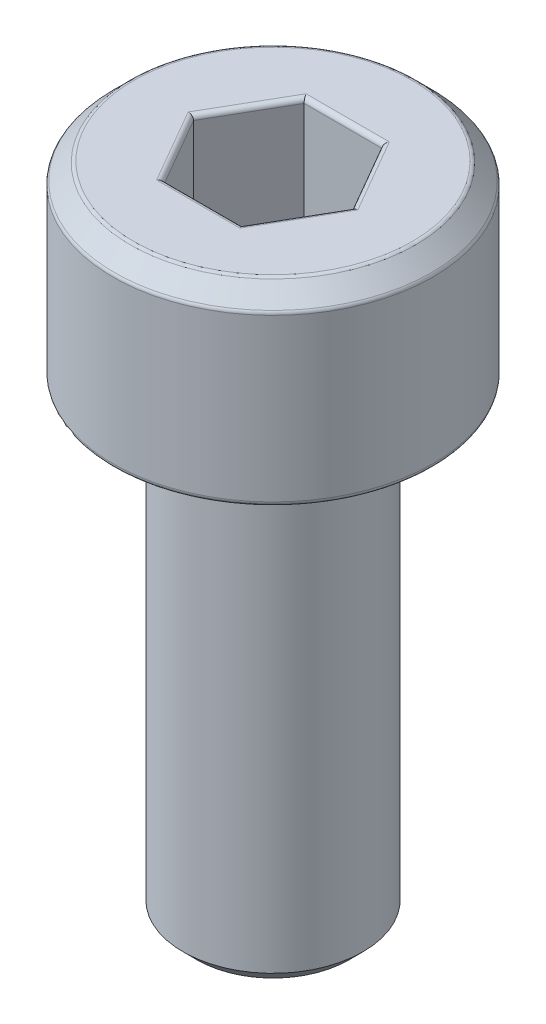
ISO-10303-21;
HEADER;
FILE_DESCRIPTION(('STEP AP214'),'2;1');
FILE_NAME('part.step','',(''),(''),'','','');
FILE_SCHEMA(('AUTOMOTIVE_DESIGN { 1 0 10303 214 1 1 1 1 }'));
ENDSEC;
DATA;
#1=APPLICATION_CONTEXT('core data for automotive mechanical design processes');
#2=APPLICATION_PROTOCOL_DEFINITION('international standard','automotive_design',2000,#1);
#3=PRODUCT_CONTEXT('',#1,'mechanical');
#4=PRODUCT('Part','Part','',(#3));
#5=PRODUCT_RELATED_PRODUCT_CATEGORY('part','',(#4));
#6=PRODUCT_DEFINITION_FORMATION('','',#4);
#7=PRODUCT_DEFINITION_CONTEXT('part definition',#1,'design');
#8=PRODUCT_DEFINITION('design','',#6,#7);
#9=PRODUCT_DEFINITION_SHAPE('','',#8);
#10=(LENGTH_UNIT() NAMED_UNIT(*) SI_UNIT(.MILLI.,.METRE.));
#11=(NAMED_UNIT(*) PLANE_ANGLE_UNIT() SI_UNIT($,.RADIAN.));
#12=(NAMED_UNIT(*) SI_UNIT($,.STERADIAN.) SOLID_ANGLE_UNIT());
#13=UNCERTAINTY_MEASURE_WITH_UNIT(LENGTH_MEASURE(1.E-05),#10,'distance_accuracy_value','');
#14=(GEOMETRIC_REPRESENTATION_CONTEXT(3) GLOBAL_UNCERTAINTY_ASSIGNED_CONTEXT((#13)) GLOBAL_UNIT_ASSIGNED_CONTEXT((#10,
#11,#12)) REPRESENTATION_CONTEXT('',''));
#15=CARTESIAN_POINT('',(0.,0.,0.));
#16=DIRECTION('',(0.,0.,1.));
#17=DIRECTION('',(1.,0.,0.));
#18=AXIS2_PLACEMENT_3D('',#15,#16,#17);
#19=CARTESIAN_POINT('',(0.,-14.,0.));
#20=DIRECTION('',(0.,-1.,0.));
#21=DIRECTION('',(0.,0.,-1.));
#22=AXIS2_PLACEMENT_3D('',#19,#20,#21);
#23=PLANE('',#22);
#24=CARTESIAN_POINT('',(0.,-14.,0.));
#25=DIRECTION('',(0.,1.,0.));
#26=DIRECTION('',(-1.,0.,0.));
#27=AXIS2_PLACEMENT_3D('',#24,#25,#26);
#28=CIRCLE('',#27,1.625);
#29=CARTESIAN_POINT('',(-1.625,-14.,0.));
#30=VERTEX_POINT('',#29);
#31=EDGE_CURVE('E11',#30,#30,#28,.T.);
#32=ORIENTED_EDGE('',*,*,#31,.F.);
#33=EDGE_LOOP('',(#32));
#34=FACE_BOUND('',#33,.T.);
#35=ADVANCED_FACE('F17',(#34),#23,.T.);
#36=CARTESIAN_POINT('',(0.,-13.85,0.));
#37=DIRECTION('',(0.,1.,0.));
#38=DIRECTION('',(1.,0.,0.));
#39=AXIS2_PLACEMENT_3D('',#36,#37,#38);
#40=CONICAL_SURFACE('',#39,1.775,0.785398163397448);
#41=CARTESIAN_POINT('',(0.,-13.7,0.));
#42=DIRECTION('',(0.,1.,0.));
#43=DIRECTION('',(-1.,0.,0.));
#44=AXIS2_PLACEMENT_3D('',#41,#42,#43);
#45=CIRCLE('',#44,1.925);
#46=CARTESIAN_POINT('',(1.925,-13.7,0.));
#47=VERTEX_POINT('',#46);
#48=EDGE_CURVE('E267',#47,#47,#45,.T.);
#49=ORIENTED_EDGE('',*,*,#48,.F.);
#50=EDGE_LOOP('',(#49));
#51=FACE_BOUND('',#50,.T.);
#52=ORIENTED_EDGE('',*,*,#31,.T.);
#53=EDGE_LOOP('',(#52));
#54=FACE_BOUND('',#53,.T.);
#55=ADVANCED_FACE('F732',(#51,#54),#40,.T.);
#56=CARTESIAN_POINT('',(0.,0.7,0.));
#57=DIRECTION('',(0.,-1.,0.));
#58=DIRECTION('',(-1.,0.,0.));
#59=AXIS2_PLACEMENT_3D('',#56,#57,#58);
#60=CYLINDRICAL_SURFACE('',#59,1.925);
#61=ORIENTED_EDGE('',*,*,#48,.T.);
#62=DIRECTION('',(0.,1.,0.));
#63=VECTOR('',#62,1.);
#64=CARTESIAN_POINT('',(1.925,0.7,0.));
#65=LINE('',#64,#63);
#66=CARTESIAN_POINT('',(1.925,-4.,0.));
#67=VERTEX_POINT('',#66);
#68=EDGE_CURVE('E28',#47,#67,#65,.T.);
#69=ORIENTED_EDGE('',*,*,#68,.T.);
#70=CARTESIAN_POINT('',(0.,-4.,0.));
#71=DIRECTION('',(0.,-1.,0.));
#72=DIRECTION('',(-1.,0.,0.));
#73=AXIS2_PLACEMENT_3D('',#70,#71,#72);
#74=CIRCLE('',#73,1.925);
#75=EDGE_CURVE('E320',#67,#67,#74,.T.);
#76=ORIENTED_EDGE('',*,*,#75,.T.);
#77=ORIENTED_EDGE('',*,*,#68,.F.);
#78=EDGE_LOOP('',(#61,#69,#76,#77));
#79=FACE_BOUND('',#78,.T.);
#80=ADVANCED_FACE('F722',(#79),#60,.T.);
#81=CARTESIAN_POINT('',(0.,-4.,0.));
#82=DIRECTION('',(0.,-1.,0.));
#83=DIRECTION('',(0.,0.,-1.));
#84=AXIS2_PLACEMENT_3D('',#81,#82,#83);
#85=PLANE('',#84);
#86=ORIENTED_EDGE('',*,*,#75,.F.);
#87=EDGE_LOOP('',(#86));
#88=FACE_BOUND('',#87,.T.);
#89=CARTESIAN_POINT('',(0.,-4.,0.));
#90=DIRECTION('',(0.,-1.,0.));
#91=DIRECTION('',(1.,0.,0.));
#92=AXIS2_PLACEMENT_3D('',#89,#90,#91);
#93=CIRCLE('',#92,3.325);
#94=CARTESIAN_POINT('',(-3.32490288162923,-4.,0.0254131409641802));
#95=VERTEX_POINT('',#94);
#96=EDGE_CURVE('E300',#95,#95,#93,.T.);
#97=ORIENTED_EDGE('',*,*,#96,.T.);
#98=EDGE_LOOP('',(#97));
#99=FACE_BOUND('',#98,.T.);
#100=ADVANCED_FACE('F713',(#88,#99),#85,.T.);
#101=CARTESIAN_POINT('',(0.,-3.9,0.));
#102=DIRECTION('',(0.,-1.,0.));
#103=DIRECTION('',(0.999970791467437,0.,-0.00764304991403928));
#104=AXIS2_PLACEMENT_3D('',#101,#102,#103);
#105=TOROIDAL_SURFACE('',#104,3.325,0.1);
#106=ORIENTED_EDGE('',*,*,#96,.F.);
#107=CARTESIAN_POINT('',(-3.32490288162923,-3.9,0.0254131409641802));
#108=DIRECTION('',(-0.00764304991403916,0.,-0.999970791467437));
#109=DIRECTION('',(-0.999970791467437,0.,0.00764304991403916));
#110=AXIS2_PLACEMENT_3D('',#107,#108,#109);
#111=CIRCLE('',#110,0.1);
#112=CARTESIAN_POINT('',(-3.42489996077597,-3.9,0.0261774459555841));
#113=VERTEX_POINT('',#112);
#114=EDGE_CURVE('E304',#95,#113,#111,.T.);
#115=ORIENTED_EDGE('',*,*,#114,.T.);
#116=CARTESIAN_POINT('',(0.,-3.9,0.));
#117=DIRECTION('',(0.,-1.,0.));
#118=DIRECTION('',(1.,0.,0.));
#119=AXIS2_PLACEMENT_3D('',#116,#117,#118);
#120=CIRCLE('',#119,3.425);
#121=CARTESIAN_POINT('',(3.425,-3.9,0.));
#122=VERTEX_POINT('',#121);
#123=EDGE_CURVE('E242',#113,#122,#120,.T.);
#124=ORIENTED_EDGE('',*,*,#123,.T.);
#125=CARTESIAN_POINT('',(0.,-3.9,0.));
#126=DIRECTION('',(0.,-1.,0.));
#127=DIRECTION('',(1.,0.,0.));
#128=AXIS2_PLACEMENT_3D('',#125,#126,#127);
#129=CIRCLE('',#128,3.425);
#130=EDGE_CURVE('E237',#122,#113,#129,.T.);
#131=ORIENTED_EDGE('',*,*,#130,.T.);
#132=ORIENTED_EDGE('',*,*,#114,.F.);
#133=EDGE_LOOP('',(#106,#115,#124,#131,#132));
#134=FACE_BOUND('',#133,.T.);
#135=ADVANCED_FACE('F704',(#134),#105,.T.);
#136=CARTESIAN_POINT('',(0.,0.7,0.));
#137=DIRECTION('',(0.,-1.,0.));
#138=DIRECTION('',(-1.,0.,0.));
#139=AXIS2_PLACEMENT_3D('',#136,#137,#138);
#140=CYLINDRICAL_SURFACE('',#139,3.425);
#141=ORIENTED_EDGE('',*,*,#123,.F.);
#142=ORIENTED_EDGE('',*,*,#130,.F.);
#143=DIRECTION('',(0.,1.,0.));
#144=VECTOR('',#143,1.);
#145=CARTESIAN_POINT('',(3.425,0.7,0.));
#146=LINE('',#145,#144);
#147=CARTESIAN_POINT('',(3.425,-0.4414213562373,0.));
#148=VERTEX_POINT('',#147);
#149=EDGE_CURVE('E241',#122,#148,#146,.T.);
#150=ORIENTED_EDGE('',*,*,#149,.T.);
#151=CARTESIAN_POINT('',(0.,-0.4414213562373,0.));
#152=DIRECTION('',(0.,-1.,0.));
#153=DIRECTION('',(1.,0.,0.));
#154=AXIS2_PLACEMENT_3D('',#151,#152,#153);
#155=CIRCLE('',#154,3.425);
#156=CARTESIAN_POINT('',(-3.42489007865533,-0.4414213562373,0.027439918518789));
#157=VERTEX_POINT('',#156);
#158=EDGE_CURVE('E110',#148,#157,#155,.T.);
#159=ORIENTED_EDGE('',*,*,#158,.T.);
#160=CARTESIAN_POINT('',(0.,-0.4414213562373,0.));
#161=DIRECTION('',(0.,-1.,0.));
#162=DIRECTION('',(1.,0.,0.));
#163=AXIS2_PLACEMENT_3D('',#160,#161,#162);
#164=CIRCLE('',#163,3.425);
#165=EDGE_CURVE('E249',#157,#148,#164,.T.);
#166=ORIENTED_EDGE('',*,*,#165,.T.);
#167=ORIENTED_EDGE('',*,*,#149,.F.);
#168=EDGE_LOOP('',(#141,#142,#150,#159,#166,#167));
#169=FACE_BOUND('',#168,.T.);
#170=ADVANCED_FACE('F694',(#169),#140,.T.);
#171=CARTESIAN_POINT('',(0.,-0.4414213562373,0.));
#172=DIRECTION('',(0.,-1.,0.));
#173=DIRECTION('',(0.999967906176737,0.,-0.0080116550419823));
#174=AXIS2_PLACEMENT_3D('',#171,#172,#173);
#175=TOROIDAL_SURFACE('',#174,3.325,0.1);
#176=ORIENTED_EDGE('',*,*,#165,.F.);
#177=CARTESIAN_POINT('',(-3.32489328803765,-0.4414213562373,0.0266387530145907));
#178=DIRECTION('',(-0.00801165504198218,0.,-0.999967906176737));
#179=DIRECTION('',(-0.999967906176737,0.,0.00801165504198218));
#180=AXIS2_PLACEMENT_3D('',#177,#178,#179);
#181=CIRCLE('',#180,0.1);
#182=CARTESIAN_POINT('',(-3.39560169678065,-0.3707106781187,0.0272052625754648));
#183=VERTEX_POINT('',#182);
#184=EDGE_CURVE('E252',#157,#183,#181,.T.);
#185=ORIENTED_EDGE('',*,*,#184,.T.);
#186=CARTESIAN_POINT('',(0.,-0.3707106781187,0.));
#187=DIRECTION('',(0.,-1.,0.));
#188=DIRECTION('',(-1.,0.,0.));
#189=AXIS2_PLACEMENT_3D('',#186,#187,#188);
#190=CIRCLE('',#189,3.395710678119);
#191=CARTESIAN_POINT('',(3.39571067811885,-0.37071067811885,0.));
#192=VERTEX_POINT('',#191);
#193=EDGE_CURVE('E288',#183,#192,#190,.T.);
#194=ORIENTED_EDGE('',*,*,#193,.T.);
#195=CARTESIAN_POINT('',(0.,-0.3707106781187,0.));
#196=DIRECTION('',(0.,-1.,0.));
#197=DIRECTION('',(-1.,0.,0.));
#198=AXIS2_PLACEMENT_3D('',#195,#196,#197);
#199=CIRCLE('',#198,3.395710678119);
#200=EDGE_CURVE('E299',#192,#183,#199,.T.);
#201=ORIENTED_EDGE('',*,*,#200,.T.);
#202=ORIENTED_EDGE('',*,*,#184,.F.);
#203=ORIENTED_EDGE('',*,*,#158,.F.);
#204=EDGE_LOOP('',(#176,#185,#194,#201,#202,#203));
#205=FACE_BOUND('',#204,.T.);
#206=ADVANCED_FACE('F685',(#205),#175,.T.);
#207=CARTESIAN_POINT('',(0.,-0.2,0.));
#208=DIRECTION('',(0.,-1.,0.));
#209=DIRECTION('',(-1.,0.,0.));
#210=AXIS2_PLACEMENT_3D('',#207,#208,#209);
#211=CONICAL_SURFACE('',#210,3.225,0.785398163397448);
#212=ORIENTED_EDGE('',*,*,#193,.F.);
#213=ORIENTED_EDGE('',*,*,#200,.F.);
#214=DIRECTION('',(-0.707106781186548,0.707106781186548,0.));
#215=VECTOR('',#214,1.);
#216=CARTESIAN_POINT('',(3.225,-0.2,0.));
#217=LINE('',#216,#215);
#218=CARTESIAN_POINT('',(3.054289321881,-0.02928932188135,0.));
#219=VERTEX_POINT('',#218);
#220=EDGE_CURVE('E55',#192,#219,#217,.T.);
#221=ORIENTED_EDGE('',*,*,#220,.T.);
#222=CARTESIAN_POINT('',(0.,-0.02928932188135,0.));
#223=DIRECTION('',(0.,-1.,0.));
#224=DIRECTION('',(-1.,0.,0.));
#225=AXIS2_PLACEMENT_3D('',#222,#223,#224);
#226=CIRCLE('',#225,3.054289321881);
#227=CARTESIAN_POINT('',(3.0541787631495,-0.02928932188135,-0.025987390843776));
#228=VERTEX_POINT('',#227);
#229=EDGE_CURVE('E278',#219,#228,#226,.T.);
#230=ORIENTED_EDGE('',*,*,#229,.T.);
#231=CARTESIAN_POINT('',(0.,-0.02928932188135,0.));
#232=DIRECTION('',(0.,-1.,0.));
#233=DIRECTION('',(-1.,0.,0.));
#234=AXIS2_PLACEMENT_3D('',#231,#232,#233);
#235=CIRCLE('',#234,3.054289321881);
#236=EDGE_CURVE('E289',#228,#219,#235,.T.);
#237=ORIENTED_EDGE('',*,*,#236,.T.);
#238=ORIENTED_EDGE('',*,*,#220,.F.);
#239=EDGE_LOOP('',(#212,#213,#221,#230,#237,#238));
#240=FACE_BOUND('',#239,.T.);
#241=ADVANCED_FACE('F675',(#240),#211,.T.);
#242=CARTESIAN_POINT('',(0.,-0.1,0.));
#243=DIRECTION('',(0.,-1.,0.));
#244=DIRECTION('',(-0.999963802141891,0.,0.00850849022638493));
#245=AXIS2_PLACEMENT_3D('',#242,#243,#244);
#246=TOROIDAL_SURFACE('',#245,2.983578643763,0.1);
#247=ORIENTED_EDGE('',*,*,#229,.F.);
#248=ORIENTED_EDGE('',*,*,#236,.F.);
#249=CARTESIAN_POINT('',(2.9834706446066,-0.1,-0.0253857497301079));
#250=DIRECTION('',(0.0085084902263848,0.,0.999963802141891));
#251=DIRECTION('',(0.999963802141891,0.,-0.0085084902263848));
#252=AXIS2_PLACEMENT_3D('',#249,#250,#251);
#253=CIRCLE('',#252,0.1);
#254=CARTESIAN_POINT('',(2.9834706446066,0.,-0.0253857497301079));
#255=VERTEX_POINT('',#254);
#256=EDGE_CURVE('E284',#228,#255,#253,.T.);
#257=ORIENTED_EDGE('',*,*,#256,.T.);
#258=CARTESIAN_POINT('',(0.,0.,0.));
#259=DIRECTION('',(0.,-1.,0.));
#260=DIRECTION('',(-1.,0.,0.));
#261=AXIS2_PLACEMENT_3D('',#258,#259,#260);
#262=CIRCLE('',#261,2.983578643763);
#263=EDGE_CURVE('E235',#255,#255,#262,.T.);
#264=ORIENTED_EDGE('',*,*,#263,.T.);
#265=ORIENTED_EDGE('',*,*,#256,.F.);
#266=EDGE_LOOP('',(#247,#248,#257,#264,#265));
#267=FACE_BOUND('',#266,.T.);
#268=ADVANCED_FACE('F666',(#267),#246,.T.);
#269=CARTESIAN_POINT('',(0.,-4.,0.));
#270=DIRECTION('',(0.,1.,0.));
#271=DIRECTION('',(1.,0.,0.));
#272=AXIS2_PLACEMENT_3D('',#269,#270,#271);
#273=PLANE('',#272);
#274=DIRECTION('',(-0.500000000000017,0.,0.866025403784429));
#275=VECTOR('',#274,1.);
#276=CARTESIAN_POINT('',(-0.8339745962156,-4.,-1.5));
#277=LINE('',#276,#275);
#278=CARTESIAN_POINT('',(-0.8339745962156,-4.,-1.5));
#279=VERTEX_POINT('',#278);
#280=CARTESIAN_POINT('',(-1.7,-4.,0.));
#281=VERTEX_POINT('',#280);
#282=EDGE_CURVE('E292',#279,#281,#277,.T.);
#283=ORIENTED_EDGE('',*,*,#282,.T.);
#284=DIRECTION('',(0.500000000000017,0.,0.866025403784429));
#285=VECTOR('',#284,1.);
#286=CARTESIAN_POINT('',(-1.7,-4.,0.));
#287=LINE('',#286,#285);
#288=CARTESIAN_POINT('',(-0.8339745962156,-4.,1.5));
#289=VERTEX_POINT('',#288);
#290=EDGE_CURVE('E72',#281,#289,#287,.T.);
#291=ORIENTED_EDGE('',*,*,#290,.T.);
#292=DIRECTION('',(1.,0.,0.));
#293=VECTOR('',#292,1.);
#294=CARTESIAN_POINT('',(-0.8339745962156,-4.,1.5));
#295=LINE('',#294,#293);
#296=CARTESIAN_POINT('',(0.8339745962156,-4.,1.5));
#297=VERTEX_POINT('',#296);
#298=EDGE_CURVE('E207',#289,#297,#295,.T.);
#299=ORIENTED_EDGE('',*,*,#298,.T.);
#300=DIRECTION('',(0.500000000000017,0.,-0.866025403784429));
#301=VECTOR('',#300,1.);
#302=CARTESIAN_POINT('',(0.8339745962156,-4.,1.5));
#303=LINE('',#302,#301);
#304=CARTESIAN_POINT('',(1.7,-4.,0.));
#305=VERTEX_POINT('',#304);
#306=EDGE_CURVE('E201',#297,#305,#303,.T.);
#307=ORIENTED_EDGE('',*,*,#306,.T.);
#308=DIRECTION('',(-0.500000000000017,0.,-0.866025403784429));
#309=VECTOR('',#308,1.);
#310=CARTESIAN_POINT('',(1.7,-4.,0.));
#311=LINE('',#310,#309);
#312=CARTESIAN_POINT('',(0.8339745962156,-4.,-1.5));
#313=VERTEX_POINT('',#312);
#314=EDGE_CURVE('E205',#305,#313,#311,.T.);
#315=ORIENTED_EDGE('',*,*,#314,.T.);
#316=DIRECTION('',(-1.,0.,0.));
#317=VECTOR('',#316,1.);
#318=CARTESIAN_POINT('',(0.8339745962156,-4.,-1.5));
#319=LINE('',#318,#317);
#320=EDGE_CURVE('E231',#313,#279,#319,.T.);
#321=ORIENTED_EDGE('',*,*,#320,.T.);
#322=EDGE_LOOP('',(#283,#291,#299,#307,#315,#321));
#323=FACE_BOUND('',#322,.T.);
#324=ADVANCED_FACE('F203',(#323),#273,.T.);
#325=CARTESIAN_POINT('',(-1.7,-4.,0.));
#326=DIRECTION('',(-0.866025403784429,0.,0.500000000000017));
#327=DIRECTION('',(0.,1.,0.));
#328=AXIS2_PLACEMENT_3D('',#325,#326,#327);
#329=PLANE('',#328);
#330=DIRECTION('',(-0.500000000000017,0.,-0.866025403784429));
#331=VECTOR('',#330,1.);
#332=CARTESIAN_POINT('',(-0.8339745962156,-0.1,1.5));
#333=LINE('',#332,#331);
#334=CARTESIAN_POINT('',(-0.8339745962156,-0.1,1.5));
#335=VERTEX_POINT('',#334);
#336=CARTESIAN_POINT('',(-1.7,-0.1,0.));
#337=VERTEX_POINT('',#336);
#338=EDGE_CURVE('E335',#335,#337,#333,.T.);
#339=ORIENTED_EDGE('',*,*,#338,.F.);
#340=DIRECTION('',(0.,1.,0.));
#341=VECTOR('',#340,1.);
#342=CARTESIAN_POINT('',(-0.8339745962156,-4.,1.5));
#343=LINE('',#342,#341);
#344=EDGE_CURVE('E197',#289,#335,#343,.T.);
#345=ORIENTED_EDGE('',*,*,#344,.F.);
#346=ORIENTED_EDGE('',*,*,#290,.F.);
#347=DIRECTION('',(0.,1.,0.));
#348=VECTOR('',#347,1.);
#349=CARTESIAN_POINT('',(-1.7,-4.,0.));
#350=LINE('',#349,#348);
#351=EDGE_CURVE('E186',#281,#337,#350,.T.);
#352=ORIENTED_EDGE('',*,*,#351,.T.);
#353=EDGE_LOOP('',(#339,#345,#346,#352));
#354=FACE_BOUND('',#353,.T.);
#355=ADVANCED_FACE('F648',(#354),#329,.F.);
#356=CARTESIAN_POINT('',(-0.8339745962156,-4.,1.5));
#357=DIRECTION('',(0.,0.,1.));
#358=DIRECTION('',(1.,0.,0.));
#359=AXIS2_PLACEMENT_3D('',#356,#357,#358);
#360=PLANE('',#359);
#361=DIRECTION('',(-1.,0.,0.));
#362=VECTOR('',#361,1.);
#363=CARTESIAN_POINT('',(0.8339745962156,-0.1,1.5));
#364=LINE('',#363,#362);
#365=CARTESIAN_POINT('',(0.8339745962156,-0.1,1.5));
#366=VERTEX_POINT('',#365);
#367=EDGE_CURVE('E314',#366,#335,#364,.T.);
#368=ORIENTED_EDGE('',*,*,#367,.F.);
#369=DIRECTION('',(0.,1.,0.));
#370=VECTOR('',#369,1.);
#371=CARTESIAN_POINT('',(0.8339745962156,-4.,1.5));
#372=LINE('',#371,#370);
#373=EDGE_CURVE('E211',#297,#366,#372,.T.);
#374=ORIENTED_EDGE('',*,*,#373,.F.);
#375=ORIENTED_EDGE('',*,*,#298,.F.);
#376=ORIENTED_EDGE('',*,*,#344,.T.);
#377=EDGE_LOOP('',(#368,#374,#375,#376));
#378=FACE_BOUND('',#377,.T.);
#379=ADVANCED_FACE('F639',(#378),#360,.F.);
#380=CARTESIAN_POINT('',(0.8339745962156,-4.,1.5));
#381=DIRECTION('',(0.866025403784429,0.,0.500000000000017));
#382=DIRECTION('',(0.,-1.,0.));
#383=AXIS2_PLACEMENT_3D('',#380,#381,#382);
#384=PLANE('',#383);
#385=DIRECTION('',(-0.500000000000017,0.,0.866025403784429));
#386=VECTOR('',#385,1.);
#387=CARTESIAN_POINT('',(1.7,-0.1,0.));
#388=LINE('',#387,#386);
#389=CARTESIAN_POINT('',(1.7,-0.1,0.));
#390=VERTEX_POINT('',#389);
#391=EDGE_CURVE('E217',#390,#366,#388,.T.);
#392=ORIENTED_EDGE('',*,*,#391,.F.);
#393=DIRECTION('',(0.,1.,0.));
#394=VECTOR('',#393,1.);
#395=CARTESIAN_POINT('',(1.7,-4.,0.));
#396=LINE('',#395,#394);
#397=EDGE_CURVE('E212',#305,#390,#396,.T.);
#398=ORIENTED_EDGE('',*,*,#397,.F.);
#399=ORIENTED_EDGE('',*,*,#306,.F.);
#400=ORIENTED_EDGE('',*,*,#373,.T.);
#401=EDGE_LOOP('',(#392,#398,#399,#400));
#402=FACE_BOUND('',#401,.T.);
#403=ADVANCED_FACE('F216',(#402),#384,.F.);
#404=CARTESIAN_POINT('',(1.7,-4.,0.));
#405=DIRECTION('',(0.866025403784429,0.,-0.500000000000017));
#406=DIRECTION('',(0.,-1.,0.));
#407=AXIS2_PLACEMENT_3D('',#404,#405,#406);
#408=PLANE('',#407);
#409=DIRECTION('',(0.500000000000017,0.,0.866025403784429));
#410=VECTOR('',#409,1.);
#411=CARTESIAN_POINT('',(0.8339745962156,-0.1,-1.5));
#412=LINE('',#411,#410);
#413=CARTESIAN_POINT('',(0.8339745962156,-0.1,-1.5));
#414=VERTEX_POINT('',#413);
#415=EDGE_CURVE('E328',#414,#390,#412,.T.);
#416=ORIENTED_EDGE('',*,*,#415,.F.);
#417=DIRECTION('',(0.,1.,0.));
#418=VECTOR('',#417,1.);
#419=CARTESIAN_POINT('',(0.8339745962156,-4.,-1.5));
#420=LINE('',#419,#418);
#421=EDGE_CURVE('E223',#313,#414,#420,.T.);
#422=ORIENTED_EDGE('',*,*,#421,.F.);
#423=ORIENTED_EDGE('',*,*,#314,.F.);
#424=ORIENTED_EDGE('',*,*,#397,.T.);
#425=EDGE_LOOP('',(#416,#422,#423,#424));
#426=FACE_BOUND('',#425,.T.);
#427=ADVANCED_FACE('F222',(#426),#408,.F.);
#428=CARTESIAN_POINT('',(-12.35466,-0.1,-1.6));
#429=DIRECTION('',(1.,0.,0.));
#430=DIRECTION('',(0.,1.,0.));
#431=AXIS2_PLACEMENT_3D('',#428,#429,#430);
#432=CYLINDRICAL_SURFACE('',#431,0.1);
#433=DIRECTION('',(1.,0.,0.));
#434=VECTOR('',#433,1.);
#435=CARTESIAN_POINT('',(-0.8339745962156,-0.1,-1.5));
#436=LINE('',#435,#434);
#437=CARTESIAN_POINT('',(-0.8339745962156,-0.1,-1.5));
#438=VERTEX_POINT('',#437);
#439=EDGE_CURVE('E349',#438,#414,#436,.T.);
#440=ORIENTED_EDGE('',*,*,#439,.T.);
#441=CARTESIAN_POINT('',(0.891711656628656,-0.100004334140353,-1.60000611891441));
#442=DIRECTION('',(-0.866031025342201,1.29827233282425E-05,-0.499990262881373));
#443=DIRECTION('',(0.49999025523864,-0.000154277379925414,-0.866031016110214));
#444=AXIS2_PLACEMENT_3D('',#441,#442,#443);
#445=ELLIPSE('',#444,0.115476370070806,0.100004333757192);
#446=CARTESIAN_POINT('',(0.8917096231345,0.,-1.6));
#447=VERTEX_POINT('',#446);
#448=EDGE_CURVE('E327',#414,#447,#445,.T.);
#449=ORIENTED_EDGE('',*,*,#448,.T.);
#450=DIRECTION('',(1.,0.,0.));
#451=VECTOR('',#450,1.);
#452=CARTESIAN_POINT('',(-0.8917096231345,0.,-1.6));
#453=LINE('',#452,#451);
#454=CARTESIAN_POINT('',(-0.8917096231345,0.,-1.6));
#455=VERTEX_POINT('',#454);
#456=EDGE_CURVE('E308',#455,#447,#453,.T.);
#457=ORIENTED_EDGE('',*,*,#456,.F.);
#458=CARTESIAN_POINT('',(-0.891711656628013,-0.100004334140789,-1.6000061189139));
#459=DIRECTION('',(-0.866031025341131,-1.29827261967866E-05,0.499990262883227));
#460=DIRECTION('',(0.499990255240492,0.000154277394767268,0.866031016109142));
#461=AXIS2_PLACEMENT_3D('',#458,#459,#460);
#462=ELLIPSE('',#461,0.115476370070961,0.100004333757628);
#463=EDGE_CURVE('E243',#438,#455,#462,.T.);
#464=ORIENTED_EDGE('',*,*,#463,.F.);
#465=EDGE_LOOP('',(#440,#449,#457,#464));
#466=FACE_BOUND('',#465,.T.);
#467=ADVANCED_FACE('F611',(#466),#432,.T.);
#468=CARTESIAN_POINT('',(0.8339745962156,-4.,-1.5));
#469=DIRECTION('',(0.,0.,-1.));
#470=DIRECTION('',(0.,-1.,0.));
#471=AXIS2_PLACEMENT_3D('',#468,#469,#470);
#472=PLANE('',#471);
#473=ORIENTED_EDGE('',*,*,#439,.F.);
#474=DIRECTION('',(0.,1.,0.));
#475=VECTOR('',#474,1.);
#476=CARTESIAN_POINT('',(-0.8339745962156,-4.,-1.5));
#477=LINE('',#476,#475);
#478=EDGE_CURVE('E295',#279,#438,#477,.T.);
#479=ORIENTED_EDGE('',*,*,#478,.F.);
#480=ORIENTED_EDGE('',*,*,#320,.F.);
#481=ORIENTED_EDGE('',*,*,#421,.T.);
#482=EDGE_LOOP('',(#473,#479,#480,#481));
#483=FACE_BOUND('',#482,.T.);
#484=ADVANCED_FACE('F370',(#483),#472,.F.);
#485=CARTESIAN_POINT('',(-0.8339745962156,-4.,-1.5));
#486=DIRECTION('',(-0.866025403784429,0.,-0.500000000000017));
#487=DIRECTION('',(-0.500000000000017,0.,0.866025403784429));
#488=AXIS2_PLACEMENT_3D('',#485,#486,#487);
#489=PLANE('',#488);
#490=DIRECTION('',(0.500000000000017,0.,-0.866025403784429));
#491=VECTOR('',#490,1.);
#492=CARTESIAN_POINT('',(-1.7,-0.1,0.));
#493=LINE('',#492,#491);
#494=EDGE_CURVE('E245',#337,#438,#493,.T.);
#495=ORIENTED_EDGE('',*,*,#494,.F.);
#496=ORIENTED_EDGE('',*,*,#351,.F.);
#497=ORIENTED_EDGE('',*,*,#282,.F.);
#498=ORIENTED_EDGE('',*,*,#478,.T.);
#499=EDGE_LOOP('',(#495,#496,#497,#498));
#500=FACE_BOUND('',#499,.T.);
#501=ADVANCED_FACE('F373',(#500),#489,.F.);
#502=CARTESIAN_POINT('',(-8.948436330584,-0.1,12.35466));
#503=DIRECTION('',(0.500000000000017,0.,-0.866025403784429));
#504=DIRECTION('',(0.,1.,0.));
#505=AXIS2_PLACEMENT_3D('',#502,#503,#504);
#506=CYLINDRICAL_SURFACE('',#505,0.1);
#507=ORIENTED_EDGE('',*,*,#494,.T.);
#508=ORIENTED_EDGE('',*,*,#463,.T.);
#509=DIRECTION('',(0.500000000000017,0.,-0.866025403784429));
#510=VECTOR('',#509,1.);
#511=CARTESIAN_POINT('',(-1.815470053838,0.,0.));
#512=LINE('',#511,#510);
#513=CARTESIAN_POINT('',(-1.815470053838,0.,0.));
#514=VERTEX_POINT('',#513);
#515=EDGE_CURVE('E271',#514,#455,#512,.T.);
#516=ORIENTED_EDGE('',*,*,#515,.F.);
#517=CARTESIAN_POINT('',(-1.8154763697212,-0.100004334141629,-1.29839902831694E-06));
#518=DIRECTION('',(-1.12433657387219E-05,-1.29827174518401E-05,0.999999999852518));
#519=DIRECTION('',(0.999999988036012,0.000154277402711814,1.12453685457935E-05));
#520=AXIS2_PLACEMENT_3D('',#517,#518,#519);
#521=ELLIPSE('',#520,0.115476370071653,0.100004333758468);
#522=EDGE_CURVE('E336',#337,#514,#521,.T.);
#523=ORIENTED_EDGE('',*,*,#522,.F.);
#524=EDGE_LOOP('',(#507,#508,#516,#523));
#525=FACE_BOUND('',#524,.T.);
#526=ADVANCED_FACE('F378',(#525),#506,.T.);
#527=CARTESIAN_POINT('',(5.317496222908,-0.1,12.35466));
#528=DIRECTION('',(-0.500000000000017,0.,-0.866025403784429));
#529=DIRECTION('',(0.,1.,0.));
#530=AXIS2_PLACEMENT_3D('',#527,#528,#529);
#531=CYLINDRICAL_SURFACE('',#530,0.1);
#532=DIRECTION('',(-0.500000000000017,0.,-0.866025403784429));
#533=VECTOR('',#532,1.);
#534=CARTESIAN_POINT('',(-0.8917096231345,0.,1.6));
#535=LINE('',#534,#533);
#536=CARTESIAN_POINT('',(-0.8917096231345,0.,1.6));
#537=VERTEX_POINT('',#536);
#538=EDGE_CURVE('E256',#537,#514,#535,.T.);
#539=ORIENTED_EDGE('',*,*,#538,.F.);
#540=CARTESIAN_POINT('',(-0.891713905522507,-0.100004334141807,1.60000482051551));
#541=DIRECTION('',(0.866019781975297,-1.29827176910641E-05,0.5000097369641));
#542=DIRECTION('',(0.500009732790329,0.000154277409405328,-0.866019770740498));
#543=AXIS2_PLACEMENT_3D('',#540,#541,#542);
#544=ELLIPSE('',#543,0.115476370071754,0.100004333758646);
#545=EDGE_CURVE('E160',#335,#537,#544,.T.);
#546=ORIENTED_EDGE('',*,*,#545,.F.);
#547=ORIENTED_EDGE('',*,*,#338,.T.);
#548=ORIENTED_EDGE('',*,*,#522,.T.);
#549=EDGE_LOOP('',(#539,#546,#547,#548));
#550=FACE_BOUND('',#549,.T.);
#551=ADVANCED_FACE('F380',(#550),#531,.T.);
#552=CARTESIAN_POINT('',(12.35466,-0.1,1.6));
#553=DIRECTION('',(-1.,0.,0.));
#554=DIRECTION('',(0.,1.,0.));
#555=AXIS2_PLACEMENT_3D('',#552,#553,#554);
#556=CYLINDRICAL_SURFACE('',#555,0.1);
#557=DIRECTION('',(-1.,0.,0.));
#558=VECTOR('',#557,1.);
#559=CARTESIAN_POINT('',(0.8917096231345,0.,1.6));
#560=LINE('',#559,#558);
#561=CARTESIAN_POINT('',(0.8917096231345,0.,1.6));
#562=VERTEX_POINT('',#561);
#563=EDGE_CURVE('E253',#562,#537,#560,.T.);
#564=ORIENTED_EDGE('',*,*,#563,.F.);
#565=CARTESIAN_POINT('',(0.891711656627989,-0.100004334140739,1.60000611891385));
#566=DIRECTION('',(0.866031025341111,-1.29827261502646E-05,-0.499990262883262));
#567=DIRECTION('',(0.499990255240527,-0.000154277393277676,0.866031016109122));
#568=AXIS2_PLACEMENT_3D('',#565,#566,#567);
#569=ELLIPSE('',#568,0.115476370070906,0.100004333757578);
#570=EDGE_CURVE('E149',#366,#562,#569,.T.);
#571=ORIENTED_EDGE('',*,*,#570,.F.);
#572=ORIENTED_EDGE('',*,*,#367,.T.);
#573=ORIENTED_EDGE('',*,*,#545,.T.);
#574=EDGE_LOOP('',(#564,#571,#572,#573));
#575=FACE_BOUND('',#574,.T.);
#576=ADVANCED_FACE('F19',(#575),#556,.T.);
#577=CARTESIAN_POINT('',(8.948436330584,-0.1,-12.35466));
#578=DIRECTION('',(-0.500000000000017,0.,0.866025403784429));
#579=DIRECTION('',(0.,1.,0.));
#580=AXIS2_PLACEMENT_3D('',#577,#578,#579);
#581=CYLINDRICAL_SURFACE('',#580,0.1);
#582=DIRECTION('',(-0.500000000000017,0.,0.866025403784429));
#583=VECTOR('',#582,1.);
#584=CARTESIAN_POINT('',(1.815470053838,0.,0.));
#585=LINE('',#584,#583);
#586=CARTESIAN_POINT('',(1.815470053838,0.,0.));
#587=VERTEX_POINT('',#586);
#588=EDGE_CURVE('E257',#587,#562,#585,.T.);
#589=ORIENTED_EDGE('',*,*,#588,.F.);
#590=CARTESIAN_POINT('',(1.8154763697212,-0.100004334141629,1.29839902831694E-06));
#591=DIRECTION('',(1.12433657387219E-05,-1.29827174518401E-05,-0.999999999852518));
#592=DIRECTION('',(0.999999988036012,-0.000154277402711814,1.12453685457935E-05));
#593=AXIS2_PLACEMENT_3D('',#590,#591,#592);
#594=ELLIPSE('',#593,0.115476370071653,0.100004333758468);
#595=EDGE_CURVE('E21',#390,#587,#594,.T.);
#596=ORIENTED_EDGE('',*,*,#595,.F.);
#597=ORIENTED_EDGE('',*,*,#391,.T.);
#598=ORIENTED_EDGE('',*,*,#570,.T.);
#599=EDGE_LOOP('',(#589,#596,#597,#598));
#600=FACE_BOUND('',#599,.T.);
#601=ADVANCED_FACE('F549',(#600),#581,.T.);
#602=CARTESIAN_POINT('',(-5.317496222908,-0.1,-12.35466));
#603=DIRECTION('',(0.500000000000017,0.,0.866025403784429));
#604=DIRECTION('',(0.,1.,0.));
#605=AXIS2_PLACEMENT_3D('',#602,#603,#604);
#606=CYLINDRICAL_SURFACE('',#605,0.1);
#607=DIRECTION('',(0.500000000000017,0.,0.866025403784429));
#608=VECTOR('',#607,1.);
#609=CARTESIAN_POINT('',(0.8917096231345,0.,-1.6));
#610=LINE('',#609,#608);
#611=EDGE_CURVE('E275',#447,#587,#610,.T.);
#612=ORIENTED_EDGE('',*,*,#611,.F.);
#613=ORIENTED_EDGE('',*,*,#448,.F.);
#614=ORIENTED_EDGE('',*,*,#415,.T.);
#615=ORIENTED_EDGE('',*,*,#595,.T.);
#616=EDGE_LOOP('',(#612,#613,#614,#615));
#617=FACE_BOUND('',#616,.T.);
#618=ADVANCED_FACE('F535',(#617),#606,.T.);
#619=CARTESIAN_POINT('',(0.,0.,0.));
#620=DIRECTION('',(0.,-1.,0.));
#621=DIRECTION('',(0.,0.,-1.));
#622=AXIS2_PLACEMENT_3D('',#619,#620,#621);
#623=PLANE('',#622);
#624=ORIENTED_EDGE('',*,*,#611,.T.);
#625=ORIENTED_EDGE('',*,*,#588,.T.);
#626=ORIENTED_EDGE('',*,*,#563,.T.);
#627=ORIENTED_EDGE('',*,*,#538,.T.);
#628=ORIENTED_EDGE('',*,*,#515,.T.);
#629=ORIENTED_EDGE('',*,*,#456,.T.);
#630=EDGE_LOOP('',(#624,#625,#626,#627,#628,#629));
#631=FACE_BOUND('',#630,.T.);
#632=ORIENTED_EDGE('',*,*,#263,.F.);
#633=EDGE_LOOP('',(#632));
#634=FACE_BOUND('',#633,.T.);
#635=ADVANCED_FACE('F529',(#631,#634),#623,.F.);
#636=CLOSED_SHELL('',(#35,#55,#80,#100,#135,#170,#206,#241,#268,#324,#355,#379,#403,#427,#467,
#484,#501,#526,#551,#576,#601,#618,#635));
#637=MANIFOLD_SOLID_BREP('B1',#636);
#638=ADVANCED_BREP_SHAPE_REPRESENTATION('',(#18,#637),#14);
#639=SHAPE_DEFINITION_REPRESENTATION(#9,#638);
ENDSEC;
END-ISO-10303-21;
